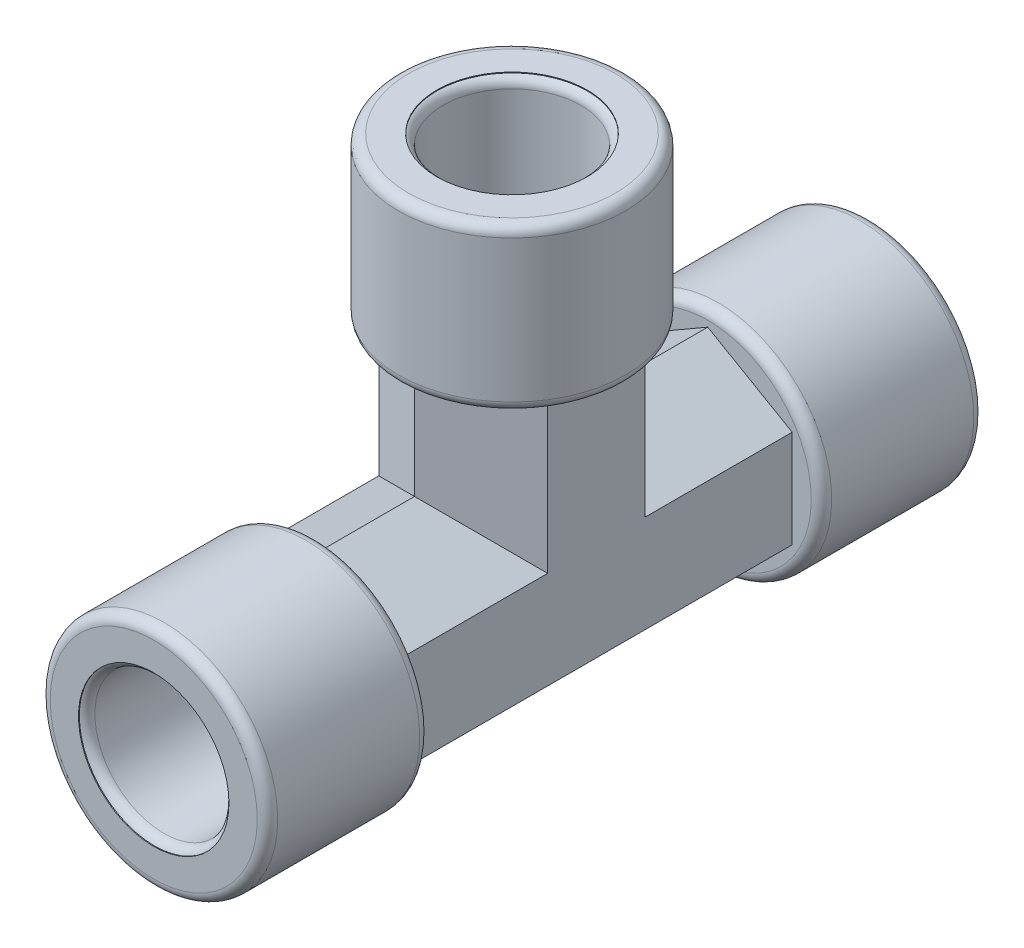
ISO-10303-21;
HEADER;
FILE_DESCRIPTION(('STEP AP214'),'2;1');
FILE_NAME('part.step','',(''),(''),'','','');
FILE_SCHEMA(('AUTOMOTIVE_DESIGN { 1 0 10303 214 1 1 1 1 }'));
ENDSEC;
DATA;
#1=APPLICATION_CONTEXT('core data for automotive mechanical design processes');
#2=APPLICATION_PROTOCOL_DEFINITION('international standard','automotive_design',2000,#1);
#3=PRODUCT_CONTEXT('',#1,'mechanical');
#4=PRODUCT('Part','Part','',(#3));
#5=PRODUCT_RELATED_PRODUCT_CATEGORY('part','',(#4));
#6=PRODUCT_DEFINITION_FORMATION('','',#4);
#7=PRODUCT_DEFINITION_CONTEXT('part definition',#1,'design');
#8=PRODUCT_DEFINITION('design','',#6,#7);
#9=PRODUCT_DEFINITION_SHAPE('','',#8);
#10=(LENGTH_UNIT() NAMED_UNIT(*) SI_UNIT(.MILLI.,.METRE.));
#11=(NAMED_UNIT(*) PLANE_ANGLE_UNIT() SI_UNIT($,.RADIAN.));
#12=(NAMED_UNIT(*) SI_UNIT($,.STERADIAN.) SOLID_ANGLE_UNIT());
#13=UNCERTAINTY_MEASURE_WITH_UNIT(LENGTH_MEASURE(1.E-05),#10,'distance_accuracy_value','');
#14=(GEOMETRIC_REPRESENTATION_CONTEXT(3) GLOBAL_UNCERTAINTY_ASSIGNED_CONTEXT((#13)) GLOBAL_UNIT_ASSIGNED_CONTEXT((#10,
#11,#12)) REPRESENTATION_CONTEXT('',''));
#15=CARTESIAN_POINT('',(0.,0.,0.));
#16=DIRECTION('',(0.,0.,1.));
#17=DIRECTION('',(1.,0.,0.));
#18=AXIS2_PLACEMENT_3D('',#15,#16,#17);
#19=CARTESIAN_POINT('',(-4.12444598552339,2.38125,35.));
#20=DIRECTION('',(1.,0.,0.));
#21=DIRECTION('',(0.,1.,0.));
#22=AXIS2_PLACEMENT_3D('',#19,#20,#21);
#23=PLANE('',#22);
#24=DIRECTION('',(0.,0.,1.));
#25=VECTOR('',#24,1.);
#26=CARTESIAN_POINT('',(-4.12444598552339,9.8025,35.));
#27=LINE('',#26,#25);
#28=CARTESIAN_POINT('',(-4.12444598552339,9.8025,15.11875));
#29=VERTEX_POINT('',#28);
#30=CARTESIAN_POINT('',(-4.12444598552339,9.8025,19.88125));
#31=VERTEX_POINT('',#30);
#32=EDGE_CURVE('E47',#29,#31,#27,.T.);
#33=ORIENTED_EDGE('',*,*,#32,.F.);
#34=DIRECTION('',(0.,-1.,0.));
#35=VECTOR('',#34,1.);
#36=CARTESIAN_POINT('',(-4.12444598552339,17.74,15.11875));
#37=LINE('',#36,#35);
#38=CARTESIAN_POINT('',(-4.12444598552339,2.38125,15.11875));
#39=VERTEX_POINT('',#38);
#40=EDGE_CURVE('E259',#29,#39,#37,.T.);
#41=ORIENTED_EDGE('',*,*,#40,.T.);
#42=DIRECTION('',(0.,0.,-1.));
#43=VECTOR('',#42,1.);
#44=CARTESIAN_POINT('',(-4.12444598552339,2.38125,35.));
#45=LINE('',#44,#43);
#46=CARTESIAN_POINT('',(-4.12444598552339,2.38125,7.9375));
#47=VERTEX_POINT('',#46);
#48=EDGE_CURVE('E285',#39,#47,#45,.T.);
#49=ORIENTED_EDGE('',*,*,#48,.T.);
#50=DIRECTION('',(0.,1.,0.));
#51=VECTOR('',#50,1.);
#52=CARTESIAN_POINT('',(-4.12444598552339,2.38125,7.9375));
#53=LINE('',#52,#51);
#54=CARTESIAN_POINT('',(-4.12444598552339,-2.38125,7.9375));
#55=VERTEX_POINT('',#54);
#56=EDGE_CURVE('E215',#55,#47,#53,.T.);
#57=ORIENTED_EDGE('',*,*,#56,.F.);
#58=DIRECTION('',(0.,0.,-1.));
#59=VECTOR('',#58,1.);
#60=CARTESIAN_POINT('',(-4.12444598552339,-2.38125,35.));
#61=LINE('',#60,#59);
#62=CARTESIAN_POINT('',(-4.12444598552339,-2.38125,27.0625));
#63=VERTEX_POINT('',#62);
#64=EDGE_CURVE('E282',#63,#55,#61,.T.);
#65=ORIENTED_EDGE('',*,*,#64,.F.);
#66=DIRECTION('',(0.,-1.,0.));
#67=VECTOR('',#66,1.);
#68=CARTESIAN_POINT('',(-4.12444598552339,2.38125,27.0625));
#69=LINE('',#68,#67);
#70=CARTESIAN_POINT('',(-4.12444598552339,2.38125,27.0625));
#71=VERTEX_POINT('',#70);
#72=EDGE_CURVE('E228',#71,#63,#69,.T.);
#73=ORIENTED_EDGE('',*,*,#72,.F.);
#74=CARTESIAN_POINT('',(-4.12444598552339,2.38125,19.88125));
#75=VERTEX_POINT('',#74);
#76=EDGE_CURVE('E286',#71,#75,#45,.T.);
#77=ORIENTED_EDGE('',*,*,#76,.T.);
#78=DIRECTION('',(0.,-1.,0.));
#79=VECTOR('',#78,1.);
#80=CARTESIAN_POINT('',(-4.12444598552339,17.74,19.88125));
#81=LINE('',#80,#79);
#82=EDGE_CURVE('E257',#31,#75,#81,.T.);
#83=ORIENTED_EDGE('',*,*,#82,.F.);
#84=EDGE_LOOP('',(#33,#41,#49,#57,#65,#73,#77,#83));
#85=FACE_BOUND('',#84,.T.);
#86=ADVANCED_FACE('F32',(#85),#23,.F.);
#87=CARTESIAN_POINT('',(4.12444598552338,-2.38125000000001,35.));
#88=DIRECTION('',(-1.,0.,0.));
#89=DIRECTION('',(0.,0.,1.));
#90=AXIS2_PLACEMENT_3D('',#87,#88,#89);
#91=PLANE('',#90);
#92=DIRECTION('',(0.,0.,-1.));
#93=VECTOR('',#92,1.);
#94=CARTESIAN_POINT('',(4.12444598552338,9.8025,35.));
#95=LINE('',#94,#93);
#96=CARTESIAN_POINT('',(4.12444598552339,9.8025,19.88125));
#97=VERTEX_POINT('',#96);
#98=CARTESIAN_POINT('',(4.12444598552339,9.8025,15.11875));
#99=VERTEX_POINT('',#98);
#100=EDGE_CURVE('E141',#97,#99,#95,.T.);
#101=ORIENTED_EDGE('',*,*,#100,.F.);
#102=DIRECTION('',(0.,-1.,0.));
#103=VECTOR('',#102,1.);
#104=CARTESIAN_POINT('',(4.12444598552339,17.74,19.88125));
#105=LINE('',#104,#103);
#106=CARTESIAN_POINT('',(4.12444598552338,2.38125000000001,19.88125));
#107=VERTEX_POINT('',#106);
#108=EDGE_CURVE('E127',#97,#107,#105,.T.);
#109=ORIENTED_EDGE('',*,*,#108,.T.);
#110=DIRECTION('',(0.,0.,-1.));
#111=VECTOR('',#110,1.);
#112=CARTESIAN_POINT('',(4.12444598552338,2.38125000000001,35.));
#113=LINE('',#112,#111);
#114=CARTESIAN_POINT('',(4.12444598552338,2.38125000000001,27.0625));
#115=VERTEX_POINT('',#114);
#116=EDGE_CURVE('E274',#115,#107,#113,.T.);
#117=ORIENTED_EDGE('',*,*,#116,.F.);
#118=DIRECTION('',(0.,1.,0.));
#119=VECTOR('',#118,1.);
#120=CARTESIAN_POINT('',(4.12444598552338,-2.38125000000001,27.0625));
#121=LINE('',#120,#119);
#122=CARTESIAN_POINT('',(4.12444598552338,-2.38125000000001,27.0625));
#123=VERTEX_POINT('',#122);
#124=EDGE_CURVE('E308',#123,#115,#121,.T.);
#125=ORIENTED_EDGE('',*,*,#124,.F.);
#126=DIRECTION('',(0.,0.,-1.));
#127=VECTOR('',#126,1.);
#128=CARTESIAN_POINT('',(4.12444598552338,-2.38125000000001,35.));
#129=LINE('',#128,#127);
#130=CARTESIAN_POINT('',(4.12444598552338,-2.38125000000001,7.9375));
#131=VERTEX_POINT('',#130);
#132=EDGE_CURVE('E276',#123,#131,#129,.T.);
#133=ORIENTED_EDGE('',*,*,#132,.T.);
#134=DIRECTION('',(0.,-1.,0.));
#135=VECTOR('',#134,1.);
#136=CARTESIAN_POINT('',(4.12444598552338,-2.38125000000001,7.9375));
#137=LINE('',#136,#135);
#138=CARTESIAN_POINT('',(4.12444598552338,2.38125000000001,7.9375));
#139=VERTEX_POINT('',#138);
#140=EDGE_CURVE('E206',#139,#131,#137,.T.);
#141=ORIENTED_EDGE('',*,*,#140,.F.);
#142=CARTESIAN_POINT('',(4.12444598552338,2.38125000000001,15.11875));
#143=VERTEX_POINT('',#142);
#144=EDGE_CURVE('E273',#143,#139,#113,.T.);
#145=ORIENTED_EDGE('',*,*,#144,.F.);
#146=DIRECTION('',(0.,-1.,0.));
#147=VECTOR('',#146,1.);
#148=CARTESIAN_POINT('',(4.12444598552339,17.74,15.11875));
#149=LINE('',#148,#147);
#150=EDGE_CURVE('E137',#99,#143,#149,.T.);
#151=ORIENTED_EDGE('',*,*,#150,.F.);
#152=EDGE_LOOP('',(#101,#109,#117,#125,#133,#141,#145,#151));
#153=FACE_BOUND('',#152,.T.);
#154=ADVANCED_FACE('F142',(#153),#91,.F.);
#155=CARTESIAN_POINT('',(0.,17.74,12.7375));
#156=DIRECTION('',(0.5,0.,0.866025403784439));
#157=DIRECTION('',(0.866025403784439,0.,-0.5));
#158=AXIS2_PLACEMENT_3D('',#155,#156,#157);
#159=PLANE('',#158);
#160=DIRECTION('',(-0.866025403784439,0.,0.5));
#161=VECTOR('',#160,1.);
#162=CARTESIAN_POINT('',(0.,9.8025,12.7375));
#163=LINE('',#162,#161);
#164=CARTESIAN_POINT('',(0.,9.8025,12.7375));
#165=VERTEX_POINT('',#164);
#166=EDGE_CURVE('E196',#165,#29,#163,.T.);
#167=ORIENTED_EDGE('',*,*,#166,.F.);
#168=DIRECTION('',(0.,-1.,0.));
#169=VECTOR('',#168,1.);
#170=CARTESIAN_POINT('',(0.,17.74,12.7375));
#171=LINE('',#170,#169);
#172=CARTESIAN_POINT('',(0.,4.7625,12.7375));
#173=VERTEX_POINT('',#172);
#174=EDGE_CURVE('E261',#165,#173,#171,.T.);
#175=ORIENTED_EDGE('',*,*,#174,.T.);
#176=DIRECTION('',(-0.774596669241483,-0.447213595499958,0.447213595499958));
#177=VECTOR('',#176,1.);
#178=CARTESIAN_POINT('',(-7.71195622070042,0.309999999999999,17.19));
#179=LINE('',#178,#177);
#180=EDGE_CURVE('E270',#173,#39,#179,.T.);
#181=ORIENTED_EDGE('',*,*,#180,.T.);
#182=ORIENTED_EDGE('',*,*,#40,.F.);
#183=EDGE_LOOP('',(#167,#175,#181,#182));
#184=FACE_BOUND('',#183,.T.);
#185=ADVANCED_FACE('F384',(#184),#159,.F.);
#186=CARTESIAN_POINT('',(-4.12444598552339,17.74,19.88125));
#187=DIRECTION('',(0.5,0.,-0.866025403784439));
#188=DIRECTION('',(-0.866025403784439,0.,-0.5));
#189=AXIS2_PLACEMENT_3D('',#186,#187,#188);
#190=PLANE('',#189);
#191=DIRECTION('',(0.866025403784439,0.,0.5));
#192=VECTOR('',#191,1.);
#193=CARTESIAN_POINT('',(-4.12444598552339,9.8025,19.88125));
#194=LINE('',#193,#192);
#195=CARTESIAN_POINT('',(0.,9.8025,22.2625));
#196=VERTEX_POINT('',#195);
#197=EDGE_CURVE('E55',#31,#196,#194,.T.);
#198=ORIENTED_EDGE('',*,*,#197,.F.);
#199=ORIENTED_EDGE('',*,*,#82,.T.);
#200=DIRECTION('',(0.774596669241483,0.447213595499958,0.447213595499958));
#201=VECTOR('',#200,1.);
#202=CARTESIAN_POINT('',(4.41239943228171,7.31,24.81));
#203=LINE('',#202,#201);
#204=CARTESIAN_POINT('',(0.,4.7625,22.2625));
#205=VERTEX_POINT('',#204);
#206=EDGE_CURVE('E267',#75,#205,#203,.T.);
#207=ORIENTED_EDGE('',*,*,#206,.T.);
#208=DIRECTION('',(0.,-1.,0.));
#209=VECTOR('',#208,1.);
#210=CARTESIAN_POINT('',(0.,17.74,22.2625));
#211=LINE('',#210,#209);
#212=EDGE_CURVE('E136',#196,#205,#211,.T.);
#213=ORIENTED_EDGE('',*,*,#212,.F.);
#214=EDGE_LOOP('',(#198,#199,#207,#213));
#215=FACE_BOUND('',#214,.T.);
#216=ADVANCED_FACE('F482',(#215),#190,.F.);
#217=CARTESIAN_POINT('',(4.12444598552339,17.74,15.11875));
#218=DIRECTION('',(-0.5,0.,0.866025403784439));
#219=DIRECTION('',(0.866025403784439,0.,0.5));
#220=AXIS2_PLACEMENT_3D('',#217,#218,#219);
#221=PLANE('',#220);
#222=DIRECTION('',(-0.866025403784439,0.,-0.5));
#223=VECTOR('',#222,1.);
#224=CARTESIAN_POINT('',(4.12444598552339,9.8025,15.11875));
#225=LINE('',#224,#223);
#226=EDGE_CURVE('E194',#99,#165,#225,.T.);
#227=ORIENTED_EDGE('',*,*,#226,.F.);
#228=ORIENTED_EDGE('',*,*,#150,.T.);
#229=DIRECTION('',(-0.774596669241484,0.447213595499957,-0.447213595499958));
#230=VECTOR('',#229,1.);
#231=CARTESIAN_POINT('',(11.0115130091191,-1.59499999999999,19.095));
#232=LINE('',#231,#230);
#233=EDGE_CURVE('E264',#143,#173,#232,.T.);
#234=ORIENTED_EDGE('',*,*,#233,.T.);
#235=ORIENTED_EDGE('',*,*,#174,.F.);
#236=EDGE_LOOP('',(#227,#228,#234,#235));
#237=FACE_BOUND('',#236,.T.);
#238=ADVANCED_FACE('F481',(#237),#221,.F.);
#239=CARTESIAN_POINT('',(0.,17.74,22.2625));
#240=DIRECTION('',(-0.5,0.,-0.866025403784439));
#241=DIRECTION('',(-0.866025403784439,0.,0.5));
#242=AXIS2_PLACEMENT_3D('',#239,#240,#241);
#243=PLANE('',#242);
#244=DIRECTION('',(0.866025403784439,0.,-0.5));
#245=VECTOR('',#244,1.);
#246=CARTESIAN_POINT('',(0.,9.8025,22.2625));
#247=LINE('',#246,#245);
#248=EDGE_CURVE('E131',#196,#97,#247,.T.);
#249=ORIENTED_EDGE('',*,*,#248,.F.);
#250=ORIENTED_EDGE('',*,*,#212,.T.);
#251=DIRECTION('',(0.774596669241484,-0.447213595499957,-0.447213595499958));
#252=VECTOR('',#251,1.);
#253=CARTESIAN_POINT('',(-1.11284264386301,5.405,22.905));
#254=LINE('',#253,#252);
#255=EDGE_CURVE('E133',#205,#107,#254,.T.);
#256=ORIENTED_EDGE('',*,*,#255,.T.);
#257=ORIENTED_EDGE('',*,*,#108,.F.);
#258=EDGE_LOOP('',(#249,#250,#256,#257));
#259=FACE_BOUND('',#258,.T.);
#260=ADVANCED_FACE('F129',(#259),#243,.F.);
#261=CARTESIAN_POINT('',(0.,17.24,17.5));
#262=DIRECTION('',(0.,1.,0.));
#263=DIRECTION('',(0.,0.,1.));
#264=AXIS2_PLACEMENT_3D('',#261,#262,#263);
#265=TOROIDAL_SURFACE('',#264,3.8734375,0.5);
#266=CARTESIAN_POINT('',(0.,17.24,17.5));
#267=DIRECTION('',(0.,1.,0.));
#268=DIRECTION('',(0.,0.,1.));
#269=AXIS2_PLACEMENT_3D('',#266,#267,#268);
#270=CIRCLE('',#269,3.3734375);
#271=CARTESIAN_POINT('',(0.,17.24,20.8734375));
#272=VERTEX_POINT('',#271);
#273=EDGE_CURVE('E302',#272,#272,#270,.T.);
#274=ORIENTED_EDGE('',*,*,#273,.F.);
#275=EDGE_LOOP('',(#274));
#276=FACE_BOUND('',#275,.T.);
#277=CARTESIAN_POINT('',(0.,17.698936333922,17.5));
#278=DIRECTION('',(0.,-1.,0.));
#279=DIRECTION('',(0.,0.,-1.));
#280=AXIS2_PLACEMENT_3D('',#277,#278,#279);
#281=CIRCLE('',#280,3.675);
#282=CARTESIAN_POINT('',(0.,17.698936333922,13.825));
#283=VERTEX_POINT('',#282);
#284=EDGE_CURVE('E158',#283,#283,#281,.F.);
#285=ORIENTED_EDGE('',*,*,#284,.T.);
#286=EDGE_LOOP('',(#285));
#287=FACE_BOUND('',#286,.T.);
#288=ADVANCED_FACE('F405',(#276,#287),#265,.T.);
#289=CARTESIAN_POINT('',(-4.12444598552339,-2.38125,35.));
#290=DIRECTION('',(0.499999999999999,0.866025403784439,0.));
#291=DIRECTION('',(-0.866025403784439,0.499999999999999,0.));
#292=AXIS2_PLACEMENT_3D('',#289,#290,#291);
#293=PLANE('',#292);
#294=DIRECTION('',(-0.866025403784439,0.499999999999999,0.));
#295=VECTOR('',#294,1.);
#296=CARTESIAN_POINT('',(-4.12444598552339,-2.38125,7.9375));
#297=LINE('',#296,#295);
#298=CARTESIAN_POINT('',(0.,-4.7625,7.9375));
#299=VERTEX_POINT('',#298);
#300=EDGE_CURVE('E212',#299,#55,#297,.T.);
#301=ORIENTED_EDGE('',*,*,#300,.F.);
#302=DIRECTION('',(0.,0.,-1.));
#303=VECTOR('',#302,1.);
#304=CARTESIAN_POINT('',(0.,-4.7625,35.));
#305=LINE('',#304,#303);
#306=CARTESIAN_POINT('',(0.,-4.7625,27.0625));
#307=VERTEX_POINT('',#306);
#308=EDGE_CURVE('E279',#307,#299,#305,.T.);
#309=ORIENTED_EDGE('',*,*,#308,.F.);
#310=DIRECTION('',(0.866025403784439,-0.499999999999999,0.));
#311=VECTOR('',#310,1.);
#312=CARTESIAN_POINT('',(-4.12444598552339,-2.38125,27.0625));
#313=LINE('',#312,#311);
#314=EDGE_CURVE('E225',#63,#307,#313,.T.);
#315=ORIENTED_EDGE('',*,*,#314,.F.);
#316=ORIENTED_EDGE('',*,*,#64,.T.);
#317=EDGE_LOOP('',(#301,#309,#315,#316));
#318=FACE_BOUND('',#317,.T.);
#319=ADVANCED_FACE('F388',(#318),#293,.F.);
#320=CARTESIAN_POINT('',(0.,-4.7625,35.));
#321=DIRECTION('',(-0.5,0.866025403784439,0.));
#322=DIRECTION('',(-0.866025403784439,-0.5,0.));
#323=AXIS2_PLACEMENT_3D('',#320,#321,#322);
#324=PLANE('',#323);
#325=DIRECTION('',(-0.866025403784439,-0.5,0.));
#326=VECTOR('',#325,1.);
#327=CARTESIAN_POINT('',(0.,-4.7625,7.9375));
#328=LINE('',#327,#326);
#329=EDGE_CURVE('E209',#131,#299,#328,.T.);
#330=ORIENTED_EDGE('',*,*,#329,.F.);
#331=ORIENTED_EDGE('',*,*,#132,.F.);
#332=DIRECTION('',(0.866025403784439,0.5,0.));
#333=VECTOR('',#332,1.);
#334=CARTESIAN_POINT('',(0.,-4.7625,27.0625));
#335=LINE('',#334,#333);
#336=EDGE_CURVE('E222',#307,#123,#335,.T.);
#337=ORIENTED_EDGE('',*,*,#336,.F.);
#338=ORIENTED_EDGE('',*,*,#308,.T.);
#339=EDGE_LOOP('',(#330,#331,#337,#338));
#340=FACE_BOUND('',#339,.T.);
#341=ADVANCED_FACE('F399',(#340),#324,.F.);
#342=CARTESIAN_POINT('',(4.12444598552338,2.38125000000001,35.));
#343=DIRECTION('',(-0.499999999999999,-0.866025403784439,0.));
#344=DIRECTION('',(0.866025403784439,-0.499999999999999,0.));
#345=AXIS2_PLACEMENT_3D('',#342,#343,#344);
#346=PLANE('',#345);
#347=DIRECTION('',(0.866025403784439,-0.499999999999999,0.));
#348=VECTOR('',#347,1.);
#349=CARTESIAN_POINT('',(4.12444598552338,2.38125000000001,7.9375));
#350=LINE('',#349,#348);
#351=CARTESIAN_POINT('',(0.,4.7625,7.9375));
#352=VERTEX_POINT('',#351);
#353=EDGE_CURVE('E203',#352,#139,#350,.T.);
#354=ORIENTED_EDGE('',*,*,#353,.F.);
#355=DIRECTION('',(0.,0.,-1.));
#356=VECTOR('',#355,1.);
#357=CARTESIAN_POINT('',(0.,4.7625,35.));
#358=LINE('',#357,#356);
#359=EDGE_CURVE('E289',#173,#352,#358,.T.);
#360=ORIENTED_EDGE('',*,*,#359,.F.);
#361=ORIENTED_EDGE('',*,*,#233,.F.);
#362=ORIENTED_EDGE('',*,*,#144,.T.);
#363=EDGE_LOOP('',(#354,#360,#361,#362));
#364=FACE_BOUND('',#363,.T.);
#365=ADVANCED_FACE('F394',(#364),#346,.F.);
#366=CARTESIAN_POINT('',(0.,4.7625,35.));
#367=DIRECTION('',(0.5,-0.866025403784438,0.));
#368=DIRECTION('',(0.866025403784439,0.5,0.));
#369=AXIS2_PLACEMENT_3D('',#366,#367,#368);
#370=PLANE('',#369);
#371=DIRECTION('',(0.866025403784439,0.5,0.));
#372=VECTOR('',#371,1.);
#373=CARTESIAN_POINT('',(0.,4.7625,7.9375));
#374=LINE('',#373,#372);
#375=EDGE_CURVE('E325',#47,#352,#374,.T.);
#376=ORIENTED_EDGE('',*,*,#375,.F.);
#377=ORIENTED_EDGE('',*,*,#48,.F.);
#378=ORIENTED_EDGE('',*,*,#180,.F.);
#379=ORIENTED_EDGE('',*,*,#359,.T.);
#380=EDGE_LOOP('',(#376,#377,#378,#379));
#381=FACE_BOUND('',#380,.T.);
#382=ADVANCED_FACE('F390',(#381),#370,.F.);
#383=CARTESIAN_POINT('',(0.,0.,0.5));
#384=DIRECTION('',(0.,0.,1.));
#385=DIRECTION('',(1.,0.,0.));
#386=AXIS2_PLACEMENT_3D('',#383,#384,#385);
#387=TOROIDAL_SURFACE('',#386,3.8734375,0.5);
#388=CARTESIAN_POINT('',(0.,0.,0.5));
#389=DIRECTION('',(0.,0.,1.));
#390=DIRECTION('',(1.,0.,0.));
#391=AXIS2_PLACEMENT_3D('',#388,#389,#390);
#392=CIRCLE('',#391,3.3734375);
#393=CARTESIAN_POINT('',(3.3734375,0.,0.5));
#394=VERTEX_POINT('',#393);
#395=EDGE_CURVE('E293',#394,#394,#392,.F.);
#396=ORIENTED_EDGE('',*,*,#395,.F.);
#397=EDGE_LOOP('',(#396));
#398=FACE_BOUND('',#397,.T.);
#399=CARTESIAN_POINT('',(0.,0.,0.0410636660780173));
#400=DIRECTION('',(0.,0.,1.));
#401=DIRECTION('',(1.,0.,0.));
#402=AXIS2_PLACEMENT_3D('',#399,#400,#401);
#403=CIRCLE('',#402,3.675);
#404=CARTESIAN_POINT('',(3.675,0.,0.0410636660780173));
#405=VERTEX_POINT('',#404);
#406=EDGE_CURVE('E202',#405,#405,#403,.F.);
#407=ORIENTED_EDGE('',*,*,#406,.T.);
#408=EDGE_LOOP('',(#407));
#409=FACE_BOUND('',#408,.T.);
#410=ADVANCED_FACE('F393',(#398,#409),#387,.T.);
#411=DIRECTION('',(-0.866025403784439,0.499999999999999,0.));
#412=VECTOR('',#411,1.);
#413=CARTESIAN_POINT('',(4.12444598552338,2.38125000000001,27.0625));
#414=LINE('',#413,#412);
#415=CARTESIAN_POINT('',(0.,4.7625,27.0625));
#416=VERTEX_POINT('',#415);
#417=EDGE_CURVE('E234',#115,#416,#414,.T.);
#418=ORIENTED_EDGE('',*,*,#417,.F.);
#419=ORIENTED_EDGE('',*,*,#116,.T.);
#420=ORIENTED_EDGE('',*,*,#255,.F.);
#421=EDGE_CURVE('E290',#416,#205,#358,.T.);
#422=ORIENTED_EDGE('',*,*,#421,.F.);
#423=EDGE_LOOP('',(#418,#419,#420,#422));
#424=FACE_BOUND('',#423,.T.);
#425=ADVANCED_FACE('F401',(#424),#346,.F.);
#426=DIRECTION('',(-0.866025403784439,-0.5,0.));
#427=VECTOR('',#426,1.);
#428=CARTESIAN_POINT('',(0.,4.7625,27.0625));
#429=LINE('',#428,#427);
#430=EDGE_CURVE('E231',#416,#71,#429,.T.);
#431=ORIENTED_EDGE('',*,*,#430,.F.);
#432=ORIENTED_EDGE('',*,*,#421,.T.);
#433=ORIENTED_EDGE('',*,*,#206,.F.);
#434=ORIENTED_EDGE('',*,*,#76,.F.);
#435=EDGE_LOOP('',(#431,#432,#433,#434));
#436=FACE_BOUND('',#435,.T.);
#437=ADVANCED_FACE('F396',(#436),#370,.F.);
#438=CARTESIAN_POINT('',(0.,0.,34.5));
#439=DIRECTION('',(0.,0.,1.));
#440=DIRECTION('',(1.,0.,0.));
#441=AXIS2_PLACEMENT_3D('',#438,#439,#440);
#442=TOROIDAL_SURFACE('',#441,3.8734375,0.5);
#443=CARTESIAN_POINT('',(0.,0.,34.5));
#444=DIRECTION('',(0.,0.,1.));
#445=DIRECTION('',(1.,0.,0.));
#446=AXIS2_PLACEMENT_3D('',#443,#444,#445);
#447=CIRCLE('',#446,3.3734375);
#448=CARTESIAN_POINT('',(3.3734375,0.,34.5));
#449=VERTEX_POINT('',#448);
#450=EDGE_CURVE('E305',#449,#449,#447,.T.);
#451=ORIENTED_EDGE('',*,*,#450,.F.);
#452=EDGE_LOOP('',(#451));
#453=FACE_BOUND('',#452,.T.);
#454=CARTESIAN_POINT('',(0.,0.,34.958936333922));
#455=DIRECTION('',(0.,0.,-1.));
#456=DIRECTION('',(-1.,0.,0.));
#457=AXIS2_PLACEMENT_3D('',#454,#455,#456);
#458=CIRCLE('',#457,3.675);
#459=CARTESIAN_POINT('',(-3.675,0.,34.958936333922));
#460=VERTEX_POINT('',#459);
#461=EDGE_CURVE('E221',#460,#460,#458,.F.);
#462=ORIENTED_EDGE('',*,*,#461,.T.);
#463=EDGE_LOOP('',(#462));
#464=FACE_BOUND('',#463,.T.);
#465=ADVANCED_FACE('F409',(#453,#464),#442,.T.);
#466=CARTESIAN_POINT('',(0.,-4.7635,17.5));
#467=DIRECTION('',(0.,1.,0.));
#468=DIRECTION('',(0.,0.,1.));
#469=AXIS2_PLACEMENT_3D('',#466,#467,#468);
#470=CYLINDRICAL_SURFACE('',#469,2.38125);
#471=CARTESIAN_POINT('',(0.,0.,17.5));
#472=DIRECTION('',(0.,0.707106781186547,0.707106781186547));
#473=DIRECTION('',(0.,0.707106781186547,-0.707106781186547));
#474=AXIS2_PLACEMENT_3D('',#471,#472,#473);
#475=ELLIPSE('',#474,3.36759604540093,2.38125);
#476=CARTESIAN_POINT('',(2.38125,0.,17.5));
#477=VERTEX_POINT('',#476);
#478=CARTESIAN_POINT('',(-2.38125,0.,17.5));
#479=VERTEX_POINT('',#478);
#480=EDGE_CURVE('E252',#477,#479,#475,.T.);
#481=ORIENTED_EDGE('',*,*,#480,.F.);
#482=CARTESIAN_POINT('',(0.,0.,17.5));
#483=DIRECTION('',(0.,0.707106781186547,-0.707106781186547));
#484=DIRECTION('',(0.,0.707106781186547,0.707106781186547));
#485=AXIS2_PLACEMENT_3D('',#482,#483,#484);
#486=ELLIPSE('',#485,3.36759604540093,2.38125);
#487=EDGE_CURVE('E249',#479,#477,#486,.T.);
#488=ORIENTED_EDGE('',*,*,#487,.F.);
#489=EDGE_LOOP('',(#481,#488));
#490=FACE_BOUND('',#489,.T.);
#491=CARTESIAN_POINT('',(0.,11.39,17.5));
#492=DIRECTION('',(0.,1.,0.));
#493=DIRECTION('',(0.,0.,1.));
#494=AXIS2_PLACEMENT_3D('',#491,#492,#493);
#495=CIRCLE('',#494,2.38125);
#496=CARTESIAN_POINT('',(0.,11.39,19.88125));
#497=VERTEX_POINT('',#496);
#498=EDGE_CURVE('E240',#497,#497,#495,.F.);
#499=ORIENTED_EDGE('',*,*,#498,.F.);
#500=EDGE_LOOP('',(#499));
#501=FACE_BOUND('',#500,.T.);
#502=ADVANCED_FACE('F412',(#490,#501),#470,.F.);
#503=CARTESIAN_POINT('',(0.,0.,35.));
#504=DIRECTION('',(0.,0.,-1.));
#505=DIRECTION('',(-1.,0.,0.));
#506=AXIS2_PLACEMENT_3D('',#503,#504,#505);
#507=CYLINDRICAL_SURFACE('',#506,2.38125);
#508=CARTESIAN_POINT('',(0.,0.,6.35));
#509=DIRECTION('',(0.,0.,-1.));
#510=DIRECTION('',(-1.,0.,0.));
#511=AXIS2_PLACEMENT_3D('',#508,#509,#510);
#512=CIRCLE('',#511,2.38125);
#513=CARTESIAN_POINT('',(-2.38125,0.,6.35));
#514=VERTEX_POINT('',#513);
#515=EDGE_CURVE('E248',#514,#514,#512,.T.);
#516=ORIENTED_EDGE('',*,*,#515,.T.);
#517=EDGE_LOOP('',(#516));
#518=FACE_BOUND('',#517,.T.);
#519=ORIENTED_EDGE('',*,*,#487,.T.);
#520=ORIENTED_EDGE('',*,*,#480,.T.);
#521=EDGE_LOOP('',(#519,#520));
#522=FACE_BOUND('',#521,.T.);
#523=CARTESIAN_POINT('',(0.,0.,28.65));
#524=DIRECTION('',(0.,0.,1.));
#525=DIRECTION('',(1.,0.,0.));
#526=AXIS2_PLACEMENT_3D('',#523,#524,#525);
#527=CIRCLE('',#526,2.38125);
#528=CARTESIAN_POINT('',(2.38125,0.,28.65));
#529=VERTEX_POINT('',#528);
#530=EDGE_CURVE('E244',#529,#529,#527,.T.);
#531=ORIENTED_EDGE('',*,*,#530,.T.);
#532=EDGE_LOOP('',(#531));
#533=FACE_BOUND('',#532,.T.);
#534=ADVANCED_FACE('F471',(#518,#522,#533),#507,.F.);
#535=CARTESIAN_POINT('',(0.,0.,6.35));
#536=DIRECTION('',(0.,0.,-1.));
#537=DIRECTION('',(-1.,0.,0.));
#538=AXIS2_PLACEMENT_3D('',#535,#536,#537);
#539=CYLINDRICAL_SURFACE('',#538,3.3734375);
#540=ORIENTED_EDGE('',*,*,#395,.T.);
#541=EDGE_LOOP('',(#540));
#542=FACE_BOUND('',#541,.T.);
#543=CARTESIAN_POINT('',(0.,0.,6.35));
#544=DIRECTION('',(0.,0.,-1.));
#545=DIRECTION('',(-1.,0.,0.));
#546=AXIS2_PLACEMENT_3D('',#543,#544,#545);
#547=CIRCLE('',#546,3.3734375);
#548=CARTESIAN_POINT('',(-3.3734375,0.,6.35));
#549=VERTEX_POINT('',#548);
#550=EDGE_CURVE('E245',#549,#549,#547,.T.);
#551=ORIENTED_EDGE('',*,*,#550,.F.);
#552=EDGE_LOOP('',(#551));
#553=FACE_BOUND('',#552,.T.);
#554=ADVANCED_FACE('F467',(#542,#553),#539,.F.);
#555=CARTESIAN_POINT('',(0.,0.,6.35));
#556=DIRECTION('',(0.,0.,-1.));
#557=DIRECTION('',(-1.,0.,0.));
#558=AXIS2_PLACEMENT_3D('',#555,#556,#557);
#559=PLANE('',#558);
#560=ORIENTED_EDGE('',*,*,#515,.F.);
#561=EDGE_LOOP('',(#560));
#562=FACE_BOUND('',#561,.T.);
#563=ORIENTED_EDGE('',*,*,#550,.T.);
#564=EDGE_LOOP('',(#563));
#565=FACE_BOUND('',#564,.T.);
#566=ADVANCED_FACE('F463',(#562,#565),#559,.T.);
#567=CARTESIAN_POINT('',(0.,0.,28.65));
#568=DIRECTION('',(0.,0.,1.));
#569=DIRECTION('',(1.,0.,0.));
#570=AXIS2_PLACEMENT_3D('',#567,#568,#569);
#571=CYLINDRICAL_SURFACE('',#570,3.3734375);
#572=ORIENTED_EDGE('',*,*,#450,.T.);
#573=EDGE_LOOP('',(#572));
#574=FACE_BOUND('',#573,.T.);
#575=CARTESIAN_POINT('',(0.,0.,28.65));
#576=DIRECTION('',(0.,0.,1.));
#577=DIRECTION('',(1.,0.,0.));
#578=AXIS2_PLACEMENT_3D('',#575,#576,#577);
#579=CIRCLE('',#578,3.3734375);
#580=CARTESIAN_POINT('',(3.3734375,0.,28.65));
#581=VERTEX_POINT('',#580);
#582=EDGE_CURVE('E241',#581,#581,#579,.T.);
#583=ORIENTED_EDGE('',*,*,#582,.F.);
#584=EDGE_LOOP('',(#583));
#585=FACE_BOUND('',#584,.T.);
#586=ADVANCED_FACE('F459',(#574,#585),#571,.F.);
#587=CARTESIAN_POINT('',(0.,0.,28.65));
#588=DIRECTION('',(0.,0.,1.));
#589=DIRECTION('',(1.,0.,0.));
#590=AXIS2_PLACEMENT_3D('',#587,#588,#589);
#591=PLANE('',#590);
#592=ORIENTED_EDGE('',*,*,#530,.F.);
#593=EDGE_LOOP('',(#592));
#594=FACE_BOUND('',#593,.T.);
#595=ORIENTED_EDGE('',*,*,#582,.T.);
#596=EDGE_LOOP('',(#595));
#597=FACE_BOUND('',#596,.T.);
#598=ADVANCED_FACE('F454',(#594,#597),#591,.T.);
#599=CARTESIAN_POINT('',(0.,11.39,17.5));
#600=DIRECTION('',(0.,1.,0.));
#601=DIRECTION('',(0.,0.,1.));
#602=AXIS2_PLACEMENT_3D('',#599,#600,#601);
#603=PLANE('',#602);
#604=CARTESIAN_POINT('',(0.,11.39,17.5));
#605=DIRECTION('',(0.,1.,0.));
#606=DIRECTION('',(0.,0.,1.));
#607=AXIS2_PLACEMENT_3D('',#604,#605,#606);
#608=CIRCLE('',#607,3.3734375);
#609=CARTESIAN_POINT('',(0.,11.39,20.8734375));
#610=VERTEX_POINT('',#609);
#611=EDGE_CURVE('E237',#610,#610,#608,.T.);
#612=ORIENTED_EDGE('',*,*,#611,.T.);
#613=EDGE_LOOP('',(#612));
#614=FACE_BOUND('',#613,.T.);
#615=ORIENTED_EDGE('',*,*,#498,.T.);
#616=EDGE_LOOP('',(#615));
#617=FACE_BOUND('',#616,.T.);
#618=ADVANCED_FACE('F445',(#614,#617),#603,.T.);
#619=CARTESIAN_POINT('',(0.,11.39,17.5));
#620=DIRECTION('',(0.,1.,0.));
#621=DIRECTION('',(0.,0.,1.));
#622=AXIS2_PLACEMENT_3D('',#619,#620,#621);
#623=CYLINDRICAL_SURFACE('',#622,3.3734375);
#624=ORIENTED_EDGE('',*,*,#273,.T.);
#625=EDGE_LOOP('',(#624));
#626=FACE_BOUND('',#625,.T.);
#627=ORIENTED_EDGE('',*,*,#611,.F.);
#628=EDGE_LOOP('',(#627));
#629=FACE_BOUND('',#628,.T.);
#630=ADVANCED_FACE('F439',(#626,#629),#623,.F.);
#631=CARTESIAN_POINT('',(0.,0.,27.0625));
#632=DIRECTION('',(0.,0.,1.));
#633=DIRECTION('',(1.,0.,0.));
#634=AXIS2_PLACEMENT_3D('',#631,#632,#633);
#635=CYLINDRICAL_SURFACE('',#634,3.675);
#636=ORIENTED_EDGE('',*,*,#461,.F.);
#637=EDGE_LOOP('',(#636));
#638=FACE_BOUND('',#637,.T.);
#639=CARTESIAN_POINT('',(0.,0.,35.));
#640=DIRECTION('',(0.,0.,1.));
#641=DIRECTION('',(1.,0.,0.));
#642=AXIS2_PLACEMENT_3D('',#639,#640,#641);
#643=CIRCLE('',#642,3.675);
#644=CARTESIAN_POINT('',(3.675,0.,35.));
#645=VERTEX_POINT('',#644);
#646=EDGE_CURVE('E218',#645,#645,#643,.T.);
#647=ORIENTED_EDGE('',*,*,#646,.T.);
#648=EDGE_LOOP('',(#647));
#649=FACE_BOUND('',#648,.T.);
#650=ADVANCED_FACE('F434',(#638,#649),#635,.F.);
#651=CARTESIAN_POINT('',(0.,4.7625,35.));
#652=DIRECTION('',(0.,0.,1.));
#653=DIRECTION('',(1.,0.,0.));
#654=AXIS2_PLACEMENT_3D('',#651,#652,#653);
#655=PLANE('',#654);
#656=CARTESIAN_POINT('',(0.,0.,35.));
#657=DIRECTION('',(0.,0.,1.));
#658=DIRECTION('',(1.,0.,0.));
#659=AXIS2_PLACEMENT_3D('',#656,#657,#658);
#660=CIRCLE('',#659,5.05625);
#661=CARTESIAN_POINT('',(5.05625,0.,35.));
#662=VERTEX_POINT('',#661);
#663=EDGE_CURVE('E322',#662,#662,#660,.T.);
#664=ORIENTED_EDGE('',*,*,#663,.T.);
#665=EDGE_LOOP('',(#664));
#666=FACE_BOUND('',#665,.T.);
#667=ORIENTED_EDGE('',*,*,#646,.F.);
#668=EDGE_LOOP('',(#667));
#669=FACE_BOUND('',#668,.T.);
#670=ADVANCED_FACE('F431',(#666,#669),#655,.T.);
#671=CARTESIAN_POINT('',(0.,0.,27.0625));
#672=DIRECTION('',(0.,0.,1.));
#673=DIRECTION('',(1.,0.,0.));
#674=AXIS2_PLACEMENT_3D('',#671,#672,#673);
#675=PLANE('',#674);
#676=CARTESIAN_POINT('',(0.,0.,27.0625));
#677=DIRECTION('',(0.,0.,1.));
#678=DIRECTION('',(1.,0.,0.));
#679=AXIS2_PLACEMENT_3D('',#676,#677,#678);
#680=CIRCLE('',#679,5.05625);
#681=CARTESIAN_POINT('',(5.05625,0.,27.0625));
#682=VERTEX_POINT('',#681);
#683=EDGE_CURVE('E319',#682,#682,#680,.F.);
#684=ORIENTED_EDGE('',*,*,#683,.T.);
#685=EDGE_LOOP('',(#684));
#686=FACE_BOUND('',#685,.T.);
#687=ORIENTED_EDGE('',*,*,#124,.T.);
#688=ORIENTED_EDGE('',*,*,#417,.T.);
#689=ORIENTED_EDGE('',*,*,#430,.T.);
#690=ORIENTED_EDGE('',*,*,#72,.T.);
#691=ORIENTED_EDGE('',*,*,#314,.T.);
#692=ORIENTED_EDGE('',*,*,#336,.T.);
#693=EDGE_LOOP('',(#687,#688,#689,#690,#691,#692));
#694=FACE_BOUND('',#693,.T.);
#695=ADVANCED_FACE('F420',(#686,#694),#675,.F.);
#696=CARTESIAN_POINT('',(0.,0.,27.0625));
#697=DIRECTION('',(0.,0.,1.));
#698=DIRECTION('',(1.,0.,0.));
#699=AXIS2_PLACEMENT_3D('',#696,#697,#698);
#700=CYLINDRICAL_SURFACE('',#699,5.55625);
#701=CARTESIAN_POINT('',(0.,0.,27.5625));
#702=DIRECTION('',(0.,0.,1.));
#703=DIRECTION('',(1.,0.,0.));
#704=AXIS2_PLACEMENT_3D('',#701,#702,#703);
#705=CIRCLE('',#704,5.55625);
#706=CARTESIAN_POINT('',(5.55625,0.,27.5625));
#707=VERTEX_POINT('',#706);
#708=EDGE_CURVE('E316',#707,#707,#705,.T.);
#709=ORIENTED_EDGE('',*,*,#708,.T.);
#710=EDGE_LOOP('',(#709));
#711=FACE_BOUND('',#710,.T.);
#712=CARTESIAN_POINT('',(0.,0.,34.5));
#713=DIRECTION('',(0.,0.,1.));
#714=DIRECTION('',(1.,0.,0.));
#715=AXIS2_PLACEMENT_3D('',#712,#713,#714);
#716=CIRCLE('',#715,5.55625);
#717=CARTESIAN_POINT('',(5.55625,0.,34.5));
#718=VERTEX_POINT('',#717);
#719=EDGE_CURVE('E313',#718,#718,#716,.F.);
#720=ORIENTED_EDGE('',*,*,#719,.T.);
#721=EDGE_LOOP('',(#720));
#722=FACE_BOUND('',#721,.T.);
#723=ADVANCED_FACE('F415',(#711,#722),#700,.T.);
#724=CARTESIAN_POINT('',(0.,0.,27.5625));
#725=DIRECTION('',(0.,0.,1.));
#726=DIRECTION('',(1.,0.,0.));
#727=AXIS2_PLACEMENT_3D('',#724,#725,#726);
#728=TOROIDAL_SURFACE('',#727,5.05625,0.5);
#729=ORIENTED_EDGE('',*,*,#683,.F.);
#730=EDGE_LOOP('',(#729));
#731=FACE_BOUND('',#730,.T.);
#732=ORIENTED_EDGE('',*,*,#708,.F.);
#733=EDGE_LOOP('',(#732));
#734=FACE_BOUND('',#733,.T.);
#735=ADVANCED_FACE('F374',(#731,#734),#728,.T.);
#736=CARTESIAN_POINT('',(0.,0.,34.5));
#737=DIRECTION('',(0.,0.,1.));
#738=DIRECTION('',(1.,0.,0.));
#739=AXIS2_PLACEMENT_3D('',#736,#737,#738);
#740=TOROIDAL_SURFACE('',#739,5.05625,0.5);
#741=ORIENTED_EDGE('',*,*,#719,.F.);
#742=EDGE_LOOP('',(#741));
#743=FACE_BOUND('',#742,.T.);
#744=ORIENTED_EDGE('',*,*,#663,.F.);
#745=EDGE_LOOP('',(#744));
#746=FACE_BOUND('',#745,.T.);
#747=ADVANCED_FACE('F368',(#743,#746),#740,.T.);
#748=CARTESIAN_POINT('',(0.,0.,7.9375));
#749=DIRECTION('',(0.,0.,-1.));
#750=DIRECTION('',(-1.,0.,0.));
#751=AXIS2_PLACEMENT_3D('',#748,#749,#750);
#752=CYLINDRICAL_SURFACE('',#751,3.675);
#753=ORIENTED_EDGE('',*,*,#406,.F.);
#754=EDGE_LOOP('',(#753));
#755=FACE_BOUND('',#754,.T.);
#756=CARTESIAN_POINT('',(0.,0.,0.));
#757=DIRECTION('',(0.,0.,-1.));
#758=DIRECTION('',(-1.,0.,0.));
#759=AXIS2_PLACEMENT_3D('',#756,#757,#758);
#760=CIRCLE('',#759,3.675);
#761=CARTESIAN_POINT('',(-3.675,0.,0.));
#762=VERTEX_POINT('',#761);
#763=EDGE_CURVE('E199',#762,#762,#760,.T.);
#764=ORIENTED_EDGE('',*,*,#763,.T.);
#765=EDGE_LOOP('',(#764));
#766=FACE_BOUND('',#765,.T.);
#767=ADVANCED_FACE('F363',(#755,#766),#752,.F.);
#768=CARTESIAN_POINT('',(0.,4.7625,0.));
#769=DIRECTION('',(0.,0.,1.));
#770=DIRECTION('',(1.,0.,0.));
#771=AXIS2_PLACEMENT_3D('',#768,#769,#770);
#772=PLANE('',#771);
#773=CARTESIAN_POINT('',(0.,0.,0.));
#774=DIRECTION('',(0.,0.,1.));
#775=DIRECTION('',(1.,0.,0.));
#776=AXIS2_PLACEMENT_3D('',#773,#774,#775);
#777=CIRCLE('',#776,5.05625);
#778=CARTESIAN_POINT('',(5.05625,0.,0.));
#779=VERTEX_POINT('',#778);
#780=EDGE_CURVE('E149',#779,#779,#777,.F.);
#781=ORIENTED_EDGE('',*,*,#780,.T.);
#782=EDGE_LOOP('',(#781));
#783=FACE_BOUND('',#782,.T.);
#784=ORIENTED_EDGE('',*,*,#763,.F.);
#785=EDGE_LOOP('',(#784));
#786=FACE_BOUND('',#785,.T.);
#787=ADVANCED_FACE('F360',(#783,#786),#772,.F.);
#788=CARTESIAN_POINT('',(0.,0.,7.9375));
#789=DIRECTION('',(0.,0.,-1.));
#790=DIRECTION('',(-1.,0.,0.));
#791=AXIS2_PLACEMENT_3D('',#788,#789,#790);
#792=PLANE('',#791);
#793=CARTESIAN_POINT('',(0.,0.,7.9375));
#794=DIRECTION('',(0.,0.,-1.));
#795=DIRECTION('',(-1.,0.,0.));
#796=AXIS2_PLACEMENT_3D('',#793,#794,#795);
#797=CIRCLE('',#796,5.05625);
#798=CARTESIAN_POINT('',(-5.05625,0.,7.9375));
#799=VERTEX_POINT('',#798);
#800=EDGE_CURVE('E155',#799,#799,#797,.F.);
#801=ORIENTED_EDGE('',*,*,#800,.T.);
#802=EDGE_LOOP('',(#801));
#803=FACE_BOUND('',#802,.T.);
#804=ORIENTED_EDGE('',*,*,#300,.T.);
#805=ORIENTED_EDGE('',*,*,#56,.T.);
#806=ORIENTED_EDGE('',*,*,#375,.T.);
#807=ORIENTED_EDGE('',*,*,#353,.T.);
#808=ORIENTED_EDGE('',*,*,#140,.T.);
#809=ORIENTED_EDGE('',*,*,#329,.T.);
#810=EDGE_LOOP('',(#804,#805,#806,#807,#808,#809));
#811=FACE_BOUND('',#810,.T.);
#812=ADVANCED_FACE('F339',(#803,#811),#792,.F.);
#813=CARTESIAN_POINT('',(0.,0.,7.9375));
#814=DIRECTION('',(0.,0.,-1.));
#815=DIRECTION('',(-1.,0.,0.));
#816=AXIS2_PLACEMENT_3D('',#813,#814,#815);
#817=CYLINDRICAL_SURFACE('',#816,5.55625);
#818=CARTESIAN_POINT('',(0.,0.,7.4375));
#819=DIRECTION('',(0.,0.,-1.));
#820=DIRECTION('',(-1.,0.,0.));
#821=AXIS2_PLACEMENT_3D('',#818,#819,#820);
#822=CIRCLE('',#821,5.55625);
#823=CARTESIAN_POINT('',(-5.55625,0.,7.4375));
#824=VERTEX_POINT('',#823);
#825=EDGE_CURVE('E333',#824,#824,#822,.T.);
#826=ORIENTED_EDGE('',*,*,#825,.T.);
#827=EDGE_LOOP('',(#826));
#828=FACE_BOUND('',#827,.T.);
#829=CARTESIAN_POINT('',(0.,0.,0.5));
#830=DIRECTION('',(0.,0.,1.));
#831=DIRECTION('',(1.,0.,0.));
#832=AXIS2_PLACEMENT_3D('',#829,#830,#831);
#833=CIRCLE('',#832,5.55625);
#834=CARTESIAN_POINT('',(5.55625,0.,0.5));
#835=VERTEX_POINT('',#834);
#836=EDGE_CURVE('E330',#835,#835,#833,.T.);
#837=ORIENTED_EDGE('',*,*,#836,.T.);
#838=EDGE_LOOP('',(#837));
#839=FACE_BOUND('',#838,.T.);
#840=ADVANCED_FACE('F346',(#828,#839),#817,.T.);
#841=CARTESIAN_POINT('',(0.,0.,7.4375));
#842=DIRECTION('',(0.,0.,-1.));
#843=DIRECTION('',(-1.,0.,0.));
#844=AXIS2_PLACEMENT_3D('',#841,#842,#843);
#845=TOROIDAL_SURFACE('',#844,5.05625,0.5);
#846=ORIENTED_EDGE('',*,*,#800,.F.);
#847=EDGE_LOOP('',(#846));
#848=FACE_BOUND('',#847,.T.);
#849=ORIENTED_EDGE('',*,*,#825,.F.);
#850=EDGE_LOOP('',(#849));
#851=FACE_BOUND('',#850,.T.);
#852=ADVANCED_FACE('F342',(#848,#851),#845,.T.);
#853=CARTESIAN_POINT('',(0.,0.,0.5));
#854=DIRECTION('',(0.,0.,1.));
#855=DIRECTION('',(1.,0.,0.));
#856=AXIS2_PLACEMENT_3D('',#853,#854,#855);
#857=TOROIDAL_SURFACE('',#856,5.05625,0.5);
#858=ORIENTED_EDGE('',*,*,#836,.F.);
#859=EDGE_LOOP('',(#858));
#860=FACE_BOUND('',#859,.T.);
#861=ORIENTED_EDGE('',*,*,#780,.F.);
#862=EDGE_LOOP('',(#861));
#863=FACE_BOUND('',#862,.T.);
#864=ADVANCED_FACE('F345',(#860,#863),#857,.T.);
#865=CARTESIAN_POINT('',(0.,9.8025,17.5));
#866=DIRECTION('',(0.,1.,0.));
#867=DIRECTION('',(0.,0.,1.));
#868=AXIS2_PLACEMENT_3D('',#865,#866,#867);
#869=CYLINDRICAL_SURFACE('',#868,3.675);
#870=ORIENTED_EDGE('',*,*,#284,.F.);
#871=EDGE_LOOP('',(#870));
#872=FACE_BOUND('',#871,.T.);
#873=CARTESIAN_POINT('',(0.,17.74,17.5));
#874=DIRECTION('',(0.,1.,0.));
#875=DIRECTION('',(0.,0.,1.));
#876=AXIS2_PLACEMENT_3D('',#873,#874,#875);
#877=CIRCLE('',#876,3.675);
#878=CARTESIAN_POINT('',(0.,17.74,21.175));
#879=VERTEX_POINT('',#878);
#880=EDGE_CURVE('E187',#879,#879,#877,.T.);
#881=ORIENTED_EDGE('',*,*,#880,.T.);
#882=EDGE_LOOP('',(#881));
#883=FACE_BOUND('',#882,.T.);
#884=ADVANCED_FACE('F183',(#872,#883),#869,.F.);
#885=CARTESIAN_POINT('',(0.,17.74,12.7375));
#886=DIRECTION('',(0.,1.,0.));
#887=DIRECTION('',(0.,0.,1.));
#888=AXIS2_PLACEMENT_3D('',#885,#886,#887);
#889=PLANE('',#888);
#890=CARTESIAN_POINT('',(0.,17.74,17.5));
#891=DIRECTION('',(0.,1.,0.));
#892=DIRECTION('',(0.,0.,1.));
#893=AXIS2_PLACEMENT_3D('',#890,#891,#892);
#894=CIRCLE('',#893,5.05625);
#895=CARTESIAN_POINT('',(0.,17.74,22.55625));
#896=VERTEX_POINT('',#895);
#897=EDGE_CURVE('E11',#896,#896,#894,.T.);
#898=ORIENTED_EDGE('',*,*,#897,.T.);
#899=EDGE_LOOP('',(#898));
#900=FACE_BOUND('',#899,.T.);
#901=ORIENTED_EDGE('',*,*,#880,.F.);
#902=EDGE_LOOP('',(#901));
#903=FACE_BOUND('',#902,.T.);
#904=ADVANCED_FACE('F180',(#900,#903),#889,.T.);
#905=CARTESIAN_POINT('',(0.,9.8025,17.5));
#906=DIRECTION('',(0.,1.,0.));
#907=DIRECTION('',(0.,0.,1.));
#908=AXIS2_PLACEMENT_3D('',#905,#906,#907);
#909=PLANE('',#908);
#910=CARTESIAN_POINT('',(0.,9.8025,17.5));
#911=DIRECTION('',(0.,1.,0.));
#912=DIRECTION('',(0.,0.,1.));
#913=AXIS2_PLACEMENT_3D('',#910,#911,#912);
#914=CIRCLE('',#913,5.05625);
#915=CARTESIAN_POINT('',(0.,9.8025,22.55625));
#916=VERTEX_POINT('',#915);
#917=EDGE_CURVE('E40',#916,#916,#914,.F.);
#918=ORIENTED_EDGE('',*,*,#917,.T.);
#919=EDGE_LOOP('',(#918));
#920=FACE_BOUND('',#919,.T.);
#921=ORIENTED_EDGE('',*,*,#226,.T.);
#922=ORIENTED_EDGE('',*,*,#166,.T.);
#923=ORIENTED_EDGE('',*,*,#32,.T.);
#924=ORIENTED_EDGE('',*,*,#197,.T.);
#925=ORIENTED_EDGE('',*,*,#248,.T.);
#926=ORIENTED_EDGE('',*,*,#100,.T.);
#927=EDGE_LOOP('',(#921,#922,#923,#924,#925,#926));
#928=FACE_BOUND('',#927,.T.);
#929=ADVANCED_FACE('F147',(#920,#928),#909,.F.);
#930=CARTESIAN_POINT('',(0.,9.8025,17.5));
#931=DIRECTION('',(0.,1.,0.));
#932=DIRECTION('',(0.,0.,1.));
#933=AXIS2_PLACEMENT_3D('',#930,#931,#932);
#934=CYLINDRICAL_SURFACE('',#933,5.55625);
#935=CARTESIAN_POINT('',(0.,10.3025,17.5));
#936=DIRECTION('',(0.,1.,0.));
#937=DIRECTION('',(0.,0.,1.));
#938=AXIS2_PLACEMENT_3D('',#935,#936,#937);
#939=CIRCLE('',#938,5.55625);
#940=CARTESIAN_POINT('',(0.,10.3025,23.05625));
#941=VERTEX_POINT('',#940);
#942=EDGE_CURVE('E152',#941,#941,#939,.T.);
#943=ORIENTED_EDGE('',*,*,#942,.T.);
#944=EDGE_LOOP('',(#943));
#945=FACE_BOUND('',#944,.T.);
#946=CARTESIAN_POINT('',(0.,17.24,17.5));
#947=DIRECTION('',(0.,1.,0.));
#948=DIRECTION('',(0.,0.,1.));
#949=AXIS2_PLACEMENT_3D('',#946,#947,#948);
#950=CIRCLE('',#949,5.55625);
#951=CARTESIAN_POINT('',(0.,17.24,23.05625));
#952=VERTEX_POINT('',#951);
#953=EDGE_CURVE('E148',#952,#952,#950,.F.);
#954=ORIENTED_EDGE('',*,*,#953,.T.);
#955=EDGE_LOOP('',(#954));
#956=FACE_BOUND('',#955,.T.);
#957=ADVANCED_FACE('F168',(#945,#956),#934,.T.);
#958=CARTESIAN_POINT('',(0.,10.3025,17.5));
#959=DIRECTION('',(0.,1.,0.));
#960=DIRECTION('',(0.,0.,1.));
#961=AXIS2_PLACEMENT_3D('',#958,#959,#960);
#962=TOROIDAL_SURFACE('',#961,5.05625,0.5);
#963=ORIENTED_EDGE('',*,*,#917,.F.);
#964=EDGE_LOOP('',(#963));
#965=FACE_BOUND('',#964,.T.);
#966=ORIENTED_EDGE('',*,*,#942,.F.);
#967=EDGE_LOOP('',(#966));
#968=FACE_BOUND('',#967,.T.);
#969=ADVANCED_FACE('F165',(#965,#968),#962,.T.);
#970=CARTESIAN_POINT('',(0.,17.24,17.5));
#971=DIRECTION('',(0.,1.,0.));
#972=DIRECTION('',(0.,0.,1.));
#973=AXIS2_PLACEMENT_3D('',#970,#971,#972);
#974=TOROIDAL_SURFACE('',#973,5.05625,0.5);
#975=ORIENTED_EDGE('',*,*,#953,.F.);
#976=EDGE_LOOP('',(#975));
#977=FACE_BOUND('',#976,.T.);
#978=ORIENTED_EDGE('',*,*,#897,.F.);
#979=EDGE_LOOP('',(#978));
#980=FACE_BOUND('',#979,.T.);
#981=ADVANCED_FACE('F34',(#977,#980),#974,.T.);
#982=CLOSED_SHELL('',(#86,#154,#185,#216,#238,#260,#288,#319,#341,#365,#382,#410,#425,#437,#465,
#502,#534,#554,#566,#586,#598,#618,#630,#650,#670,#695,#723,#735,#747,#767,#787,#812,#840,#852,
#864,#884,#904,#929,#957,#969,#981));
#983=MANIFOLD_SOLID_BREP('B2',#982);
#984=ADVANCED_BREP_SHAPE_REPRESENTATION('',(#18,#983),#14);
#985=SHAPE_DEFINITION_REPRESENTATION(#9,#984);
ENDSEC;
END-ISO-10303-21;
